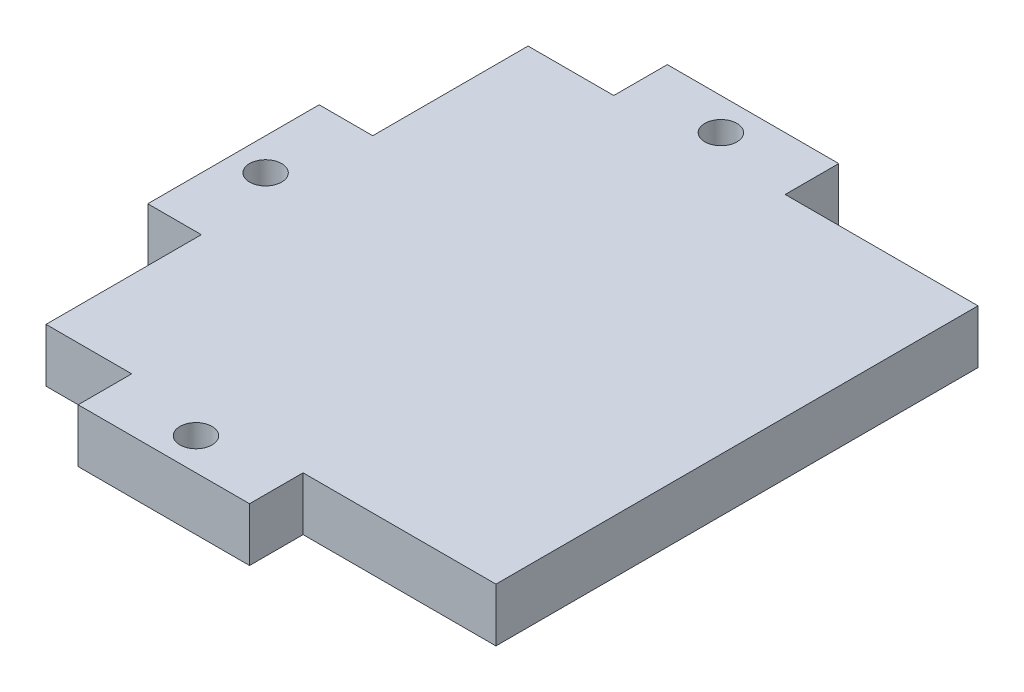
ISO-10303-21;
HEADER;
FILE_DESCRIPTION(('STEP AP214'),'2;1');
FILE_NAME('part.step','',(''),(''),'','','');
FILE_SCHEMA(('AUTOMOTIVE_DESIGN { 1 0 10303 214 1 1 1 1 }'));
ENDSEC;
DATA;
#1=APPLICATION_CONTEXT('core data for automotive mechanical design processes');
#2=APPLICATION_PROTOCOL_DEFINITION('international standard','automotive_design',2000,#1);
#3=PRODUCT_CONTEXT('',#1,'mechanical');
#4=PRODUCT('Part','Part','',(#3));
#5=PRODUCT_RELATED_PRODUCT_CATEGORY('part','',(#4));
#6=PRODUCT_DEFINITION_FORMATION('','',#4);
#7=PRODUCT_DEFINITION_CONTEXT('part definition',#1,'design');
#8=PRODUCT_DEFINITION('design','',#6,#7);
#9=PRODUCT_DEFINITION_SHAPE('','',#8);
#10=(LENGTH_UNIT() NAMED_UNIT(*) SI_UNIT(.MILLI.,.METRE.));
#11=(NAMED_UNIT(*) PLANE_ANGLE_UNIT() SI_UNIT($,.RADIAN.));
#12=(NAMED_UNIT(*) SI_UNIT($,.STERADIAN.) SOLID_ANGLE_UNIT());
#13=UNCERTAINTY_MEASURE_WITH_UNIT(LENGTH_MEASURE(1.E-05),#10,'distance_accuracy_value','');
#14=(GEOMETRIC_REPRESENTATION_CONTEXT(3) GLOBAL_UNCERTAINTY_ASSIGNED_CONTEXT((#13)) GLOBAL_UNIT_ASSIGNED_CONTEXT((#10,
#11,#12)) REPRESENTATION_CONTEXT('',''));
#15=CARTESIAN_POINT('',(0.,0.,0.));
#16=DIRECTION('',(0.,0.,1.));
#17=DIRECTION('',(1.,0.,0.));
#18=AXIS2_PLACEMENT_3D('',#15,#16,#17);
#19=CARTESIAN_POINT('',(-16.,5.,22.5));
#20=DIRECTION('',(1.,0.,0.));
#21=DIRECTION('',(0.,0.,-1.));
#22=AXIS2_PLACEMENT_3D('',#19,#20,#21);
#23=PLANE('',#22);
#24=DIRECTION('',(0.,0.,1.));
#25=VECTOR('',#24,1.);
#26=CARTESIAN_POINT('',(-16.,0.,22.5));
#27=LINE('',#26,#25);
#28=CARTESIAN_POINT('',(-16.,0.,-22.5));
#29=VERTEX_POINT('',#28);
#30=CARTESIAN_POINT('',(-16.,0.,-8.));
#31=VERTEX_POINT('',#30);
#32=EDGE_CURVE('E164',#29,#31,#27,.T.);
#33=ORIENTED_EDGE('',*,*,#32,.T.);
#34=DIRECTION('',(0.,1.,0.));
#35=VECTOR('',#34,1.);
#36=CARTESIAN_POINT('',(-16.,5.,-8.));
#37=LINE('',#36,#35);
#38=CARTESIAN_POINT('',(-16.,5.,-8.));
#39=VERTEX_POINT('',#38);
#40=EDGE_CURVE('E212',#31,#39,#37,.T.);
#41=ORIENTED_EDGE('',*,*,#40,.T.);
#42=DIRECTION('',(0.,0.,1.));
#43=VECTOR('',#42,1.);
#44=CARTESIAN_POINT('',(-16.,5.,22.5));
#45=LINE('',#44,#43);
#46=CARTESIAN_POINT('',(-16.,5.,-22.5));
#47=VERTEX_POINT('',#46);
#48=EDGE_CURVE('E274',#47,#39,#45,.T.);
#49=ORIENTED_EDGE('',*,*,#48,.F.);
#50=DIRECTION('',(0.,-1.,0.));
#51=VECTOR('',#50,1.);
#52=CARTESIAN_POINT('',(-16.,5.,-22.5));
#53=LINE('',#52,#51);
#54=EDGE_CURVE('E48',#47,#29,#53,.T.);
#55=ORIENTED_EDGE('',*,*,#54,.T.);
#56=EDGE_LOOP('',(#33,#41,#49,#55));
#57=FACE_BOUND('',#56,.T.);
#58=ADVANCED_FACE('F40',(#57),#23,.F.);
#59=CARTESIAN_POINT('',(16.,5.,22.5));
#60=DIRECTION('',(0.,0.,-1.));
#61=DIRECTION('',(-1.,0.,0.));
#62=AXIS2_PLACEMENT_3D('',#59,#60,#61);
#63=PLANE('',#62);
#64=DIRECTION('',(0.,-1.,0.));
#65=VECTOR('',#64,1.);
#66=CARTESIAN_POINT('',(-8.,5.,22.5));
#67=LINE('',#66,#65);
#68=CARTESIAN_POINT('',(-8.,5.,22.5));
#69=VERTEX_POINT('',#68);
#70=CARTESIAN_POINT('',(-8.,0.,22.5));
#71=VERTEX_POINT('',#70);
#72=EDGE_CURVE('E240',#69,#71,#67,.T.);
#73=ORIENTED_EDGE('',*,*,#72,.F.);
#74=DIRECTION('',(1.,0.,0.));
#75=VECTOR('',#74,1.);
#76=CARTESIAN_POINT('',(16.,5.,22.5));
#77=LINE('',#76,#75);
#78=CARTESIAN_POINT('',(-16.,5.,22.5));
#79=VERTEX_POINT('',#78);
#80=EDGE_CURVE('E279',#79,#69,#77,.T.);
#81=ORIENTED_EDGE('',*,*,#80,.F.);
#82=DIRECTION('',(0.,-1.,0.));
#83=VECTOR('',#82,1.);
#84=CARTESIAN_POINT('',(-16.,5.,22.5));
#85=LINE('',#84,#83);
#86=CARTESIAN_POINT('',(-16.,0.,22.5));
#87=VERTEX_POINT('',#86);
#88=EDGE_CURVE('E11',#79,#87,#85,.T.);
#89=ORIENTED_EDGE('',*,*,#88,.T.);
#90=DIRECTION('',(1.,0.,0.));
#91=VECTOR('',#90,1.);
#92=CARTESIAN_POINT('',(16.,0.,22.5));
#93=LINE('',#92,#91);
#94=EDGE_CURVE('E163',#87,#71,#93,.T.);
#95=ORIENTED_EDGE('',*,*,#94,.T.);
#96=EDGE_LOOP('',(#73,#81,#89,#95));
#97=FACE_BOUND('',#96,.T.);
#98=ADVANCED_FACE('F336',(#97),#63,.F.);
#99=DIRECTION('',(0.,1.,0.));
#100=VECTOR('',#99,1.);
#101=CARTESIAN_POINT('',(8.,5.,22.5));
#102=LINE('',#101,#100);
#103=CARTESIAN_POINT('',(8.,0.,22.5));
#104=VERTEX_POINT('',#103);
#105=CARTESIAN_POINT('',(8.,5.,22.5));
#106=VERTEX_POINT('',#105);
#107=EDGE_CURVE('E160',#104,#106,#102,.T.);
#108=ORIENTED_EDGE('',*,*,#107,.F.);
#109=CARTESIAN_POINT('',(26.,0.,22.5));
#110=VERTEX_POINT('',#109);
#111=EDGE_CURVE('E154',#104,#110,#93,.T.);
#112=ORIENTED_EDGE('',*,*,#111,.T.);
#113=DIRECTION('',(0.,1.,0.));
#114=VECTOR('',#113,1.);
#115=CARTESIAN_POINT('',(26.,0.,22.5));
#116=LINE('',#115,#114);
#117=CARTESIAN_POINT('',(26.,5.,22.5));
#118=VERTEX_POINT('',#117);
#119=EDGE_CURVE('E158',#110,#118,#116,.T.);
#120=ORIENTED_EDGE('',*,*,#119,.T.);
#121=EDGE_CURVE('E277',#106,#118,#77,.T.);
#122=ORIENTED_EDGE('',*,*,#121,.F.);
#123=EDGE_LOOP('',(#108,#112,#120,#122));
#124=FACE_BOUND('',#123,.T.);
#125=ADVANCED_FACE('F156',(#124),#63,.F.);
#126=CARTESIAN_POINT('',(16.,5.,-22.5));
#127=DIRECTION('',(0.,0.,1.));
#128=DIRECTION('',(1.,0.,0.));
#129=AXIS2_PLACEMENT_3D('',#126,#127,#128);
#130=PLANE('',#129);
#131=DIRECTION('',(-1.,0.,0.));
#132=VECTOR('',#131,1.);
#133=CARTESIAN_POINT('',(16.,5.,-22.5));
#134=LINE('',#133,#132);
#135=CARTESIAN_POINT('',(-8.,5.,-22.5));
#136=VERTEX_POINT('',#135);
#137=EDGE_CURVE('E282',#136,#47,#134,.T.);
#138=ORIENTED_EDGE('',*,*,#137,.F.);
#139=DIRECTION('',(0.,-1.,0.));
#140=VECTOR('',#139,1.);
#141=CARTESIAN_POINT('',(-8.,5.,-22.5));
#142=LINE('',#141,#140);
#143=CARTESIAN_POINT('',(-8.,0.,-22.5));
#144=VERTEX_POINT('',#143);
#145=EDGE_CURVE('E270',#136,#144,#142,.T.);
#146=ORIENTED_EDGE('',*,*,#145,.T.);
#147=DIRECTION('',(-1.,0.,0.));
#148=VECTOR('',#147,1.);
#149=CARTESIAN_POINT('',(16.,0.,-22.5));
#150=LINE('',#149,#148);
#151=EDGE_CURVE('E289',#144,#29,#150,.T.);
#152=ORIENTED_EDGE('',*,*,#151,.T.);
#153=ORIENTED_EDGE('',*,*,#54,.F.);
#154=EDGE_LOOP('',(#138,#146,#152,#153));
#155=FACE_BOUND('',#154,.T.);
#156=ADVANCED_FACE('F312',(#155),#130,.F.);
#157=CARTESIAN_POINT('',(-16.,5.,8.));
#158=VERTEX_POINT('',#157);
#159=EDGE_CURVE('E278',#158,#79,#45,.T.);
#160=ORIENTED_EDGE('',*,*,#159,.F.);
#161=DIRECTION('',(0.,-1.,0.));
#162=VECTOR('',#161,1.);
#163=CARTESIAN_POINT('',(-16.,5.,8.));
#164=LINE('',#163,#162);
#165=CARTESIAN_POINT('',(-16.,0.,8.));
#166=VERTEX_POINT('',#165);
#167=EDGE_CURVE('E208',#158,#166,#164,.T.);
#168=ORIENTED_EDGE('',*,*,#167,.T.);
#169=EDGE_CURVE('E273',#166,#87,#27,.T.);
#170=ORIENTED_EDGE('',*,*,#169,.T.);
#171=ORIENTED_EDGE('',*,*,#88,.F.);
#172=EDGE_LOOP('',(#160,#168,#170,#171));
#173=FACE_BOUND('',#172,.T.);
#174=ADVANCED_FACE('F42',(#173),#23,.F.);
#175=CARTESIAN_POINT('',(26.,0.,-22.5));
#176=VERTEX_POINT('',#175);
#177=CARTESIAN_POINT('',(8.,0.,-22.5));
#178=VERTEX_POINT('',#177);
#179=EDGE_CURVE('E180',#176,#178,#150,.T.);
#180=ORIENTED_EDGE('',*,*,#179,.T.);
#181=DIRECTION('',(0.,1.,0.));
#182=VECTOR('',#181,1.);
#183=CARTESIAN_POINT('',(8.,5.,-22.5));
#184=LINE('',#183,#182);
#185=CARTESIAN_POINT('',(8.,5.,-22.5));
#186=VERTEX_POINT('',#185);
#187=EDGE_CURVE('E265',#178,#186,#184,.T.);
#188=ORIENTED_EDGE('',*,*,#187,.T.);
#189=CARTESIAN_POINT('',(26.,5.,-22.5));
#190=VERTEX_POINT('',#189);
#191=EDGE_CURVE('E283',#190,#186,#134,.T.);
#192=ORIENTED_EDGE('',*,*,#191,.F.);
#193=DIRECTION('',(0.,1.,0.));
#194=VECTOR('',#193,1.);
#195=CARTESIAN_POINT('',(26.,0.,-22.5));
#196=LINE('',#195,#194);
#197=EDGE_CURVE('E173',#176,#190,#196,.T.);
#198=ORIENTED_EDGE('',*,*,#197,.F.);
#199=EDGE_LOOP('',(#180,#188,#192,#198));
#200=FACE_BOUND('',#199,.T.);
#201=ADVANCED_FACE('F323',(#200),#130,.F.);
#202=CARTESIAN_POINT('',(0.,5.,0.));
#203=DIRECTION('',(0.,1.,0.));
#204=DIRECTION('',(0.,0.,1.));
#205=AXIS2_PLACEMENT_3D('',#202,#203,#204);
#206=PLANE('',#205);
#207=CARTESIAN_POINT('',(-18.,5.,0.));
#208=DIRECTION('',(0.,1.,0.));
#209=DIRECTION('',(0.,0.,1.));
#210=AXIS2_PLACEMENT_3D('',#207,#208,#209);
#211=CIRCLE('',#210,1.5);
#212=CARTESIAN_POINT('',(-18.,5.,1.5));
#213=VERTEX_POINT('',#212);
#214=EDGE_CURVE('E185',#213,#213,#211,.T.);
#215=ORIENTED_EDGE('',*,*,#214,.F.);
#216=EDGE_LOOP('',(#215));
#217=FACE_BOUND('',#216,.T.);
#218=ORIENTED_EDGE('',*,*,#48,.T.);
#219=DIRECTION('',(-1.,0.,0.));
#220=VECTOR('',#219,1.);
#221=CARTESIAN_POINT('',(-11.,5.,-8.));
#222=LINE('',#221,#220);
#223=CARTESIAN_POINT('',(-21.,5.,-7.99999999999999));
#224=VERTEX_POINT('',#223);
#225=EDGE_CURVE('E197',#39,#224,#222,.T.);
#226=ORIENTED_EDGE('',*,*,#225,.T.);
#227=DIRECTION('',(0.,0.,1.));
#228=VECTOR('',#227,1.);
#229=CARTESIAN_POINT('',(-21.,5.,8.));
#230=LINE('',#229,#228);
#231=CARTESIAN_POINT('',(-21.,5.,8.));
#232=VERTEX_POINT('',#231);
#233=EDGE_CURVE('E190',#224,#232,#230,.T.);
#234=ORIENTED_EDGE('',*,*,#233,.T.);
#235=DIRECTION('',(1.,0.,0.));
#236=VECTOR('',#235,1.);
#237=CARTESIAN_POINT('',(-11.,5.,8.));
#238=LINE('',#237,#236);
#239=EDGE_CURVE('E55',#232,#158,#238,.T.);
#240=ORIENTED_EDGE('',*,*,#239,.T.);
#241=ORIENTED_EDGE('',*,*,#159,.T.);
#242=ORIENTED_EDGE('',*,*,#80,.T.);
#243=DIRECTION('',(0.,0.,-1.));
#244=VECTOR('',#243,1.);
#245=CARTESIAN_POINT('',(-8.,5.,17.5));
#246=LINE('',#245,#244);
#247=CARTESIAN_POINT('',(-8.,5.,27.5));
#248=VERTEX_POINT('',#247);
#249=EDGE_CURVE('E219',#248,#69,#246,.T.);
#250=ORIENTED_EDGE('',*,*,#249,.F.);
#251=DIRECTION('',(-1.,0.,0.));
#252=VECTOR('',#251,1.);
#253=CARTESIAN_POINT('',(8.,5.,27.5));
#254=LINE('',#253,#252);
#255=CARTESIAN_POINT('',(8.,5.,27.5));
#256=VERTEX_POINT('',#255);
#257=EDGE_CURVE('E231',#256,#248,#254,.T.);
#258=ORIENTED_EDGE('',*,*,#257,.F.);
#259=DIRECTION('',(0.,0.,1.));
#260=VECTOR('',#259,1.);
#261=CARTESIAN_POINT('',(8.,5.,17.5));
#262=LINE('',#261,#260);
#263=EDGE_CURVE('E62',#106,#256,#262,.T.);
#264=ORIENTED_EDGE('',*,*,#263,.F.);
#265=ORIENTED_EDGE('',*,*,#121,.T.);
#266=DIRECTION('',(0.,0.,-1.));
#267=VECTOR('',#266,1.);
#268=CARTESIAN_POINT('',(26.,5.,-22.5));
#269=LINE('',#268,#267);
#270=EDGE_CURVE('E172',#118,#190,#269,.T.);
#271=ORIENTED_EDGE('',*,*,#270,.T.);
#272=ORIENTED_EDGE('',*,*,#191,.T.);
#273=DIRECTION('',(0.,0.,-1.));
#274=VECTOR('',#273,1.);
#275=CARTESIAN_POINT('',(8.,5.,-17.5));
#276=LINE('',#275,#274);
#277=CARTESIAN_POINT('',(8.,5.,-27.5));
#278=VERTEX_POINT('',#277);
#279=EDGE_CURVE('E259',#186,#278,#276,.T.);
#280=ORIENTED_EDGE('',*,*,#279,.T.);
#281=DIRECTION('',(-1.,0.,0.));
#282=VECTOR('',#281,1.);
#283=CARTESIAN_POINT('',(8.,5.,-27.5));
#284=LINE('',#283,#282);
#285=CARTESIAN_POINT('',(-8.,5.,-27.5));
#286=VERTEX_POINT('',#285);
#287=EDGE_CURVE('E252',#278,#286,#284,.T.);
#288=ORIENTED_EDGE('',*,*,#287,.T.);
#289=DIRECTION('',(0.,0.,1.));
#290=VECTOR('',#289,1.);
#291=CARTESIAN_POINT('',(-8.,5.,-17.5));
#292=LINE('',#291,#290);
#293=EDGE_CURVE('E246',#286,#136,#292,.T.);
#294=ORIENTED_EDGE('',*,*,#293,.T.);
#295=ORIENTED_EDGE('',*,*,#137,.T.);
#296=EDGE_LOOP('',(#218,#226,#234,#240,#241,#242,#250,#258,#264,#265,#271,#272,#280,#288,#294,#295));
#297=FACE_BOUND('',#296,.T.);
#298=CARTESIAN_POINT('',(0.,5.,24.5));
#299=DIRECTION('',(0.,-1.,0.));
#300=DIRECTION('',(0.,0.,-1.));
#301=AXIS2_PLACEMENT_3D('',#298,#299,#300);
#302=CIRCLE('',#301,1.5);
#303=CARTESIAN_POINT('',(0.,5.,23.));
#304=VERTEX_POINT('',#303);
#305=EDGE_CURVE('E215',#304,#304,#302,.T.);
#306=ORIENTED_EDGE('',*,*,#305,.T.);
#307=EDGE_LOOP('',(#306));
#308=FACE_BOUND('',#307,.T.);
#309=CARTESIAN_POINT('',(0.,5.,-24.5));
#310=DIRECTION('',(0.,1.,0.));
#311=DIRECTION('',(0.,0.,1.));
#312=AXIS2_PLACEMENT_3D('',#309,#310,#311);
#313=CIRCLE('',#312,1.5);
#314=CARTESIAN_POINT('',(0.,5.,-23.));
#315=VERTEX_POINT('',#314);
#316=EDGE_CURVE('E242',#315,#315,#313,.T.);
#317=ORIENTED_EDGE('',*,*,#316,.F.);
#318=EDGE_LOOP('',(#317));
#319=FACE_BOUND('',#318,.T.);
#320=ADVANCED_FACE('F308',(#217,#297,#308,#319),#206,.T.);
#321=CARTESIAN_POINT('',(0.,0.,0.));
#322=DIRECTION('',(0.,1.,0.));
#323=DIRECTION('',(0.,0.,1.));
#324=AXIS2_PLACEMENT_3D('',#321,#322,#323);
#325=PLANE('',#324);
#326=CARTESIAN_POINT('',(-18.,0.,0.));
#327=DIRECTION('',(0.,1.,0.));
#328=DIRECTION('',(0.,0.,1.));
#329=AXIS2_PLACEMENT_3D('',#326,#327,#328);
#330=CIRCLE('',#329,1.5);
#331=CARTESIAN_POINT('',(-18.,0.,1.5));
#332=VERTEX_POINT('',#331);
#333=EDGE_CURVE('E187',#332,#332,#330,.T.);
#334=ORIENTED_EDGE('',*,*,#333,.T.);
#335=EDGE_LOOP('',(#334));
#336=FACE_BOUND('',#335,.T.);
#337=ORIENTED_EDGE('',*,*,#169,.F.);
#338=DIRECTION('',(1.,0.,0.));
#339=VECTOR('',#338,1.);
#340=CARTESIAN_POINT('',(-11.,0.,8.));
#341=LINE('',#340,#339);
#342=CARTESIAN_POINT('',(-21.,0.,8.));
#343=VERTEX_POINT('',#342);
#344=EDGE_CURVE('E196',#343,#166,#341,.T.);
#345=ORIENTED_EDGE('',*,*,#344,.F.);
#346=DIRECTION('',(0.,0.,1.));
#347=VECTOR('',#346,1.);
#348=CARTESIAN_POINT('',(-21.,0.,8.));
#349=LINE('',#348,#347);
#350=CARTESIAN_POINT('',(-21.,0.,-7.99999999999999));
#351=VERTEX_POINT('',#350);
#352=EDGE_CURVE('E193',#351,#343,#349,.T.);
#353=ORIENTED_EDGE('',*,*,#352,.F.);
#354=DIRECTION('',(-1.,0.,0.));
#355=VECTOR('',#354,1.);
#356=CARTESIAN_POINT('',(-11.,0.,-8.));
#357=LINE('',#356,#355);
#358=EDGE_CURVE('E199',#31,#351,#357,.T.);
#359=ORIENTED_EDGE('',*,*,#358,.F.);
#360=ORIENTED_EDGE('',*,*,#32,.F.);
#361=ORIENTED_EDGE('',*,*,#151,.F.);
#362=DIRECTION('',(0.,0.,1.));
#363=VECTOR('',#362,1.);
#364=CARTESIAN_POINT('',(-8.,0.,-17.5));
#365=LINE('',#364,#363);
#366=CARTESIAN_POINT('',(-8.,0.,-27.5));
#367=VERTEX_POINT('',#366);
#368=EDGE_CURVE('E249',#367,#144,#365,.T.);
#369=ORIENTED_EDGE('',*,*,#368,.F.);
#370=DIRECTION('',(-1.,0.,0.));
#371=VECTOR('',#370,1.);
#372=CARTESIAN_POINT('',(8.,0.,-27.5));
#373=LINE('',#372,#371);
#374=CARTESIAN_POINT('',(8.,0.,-27.5));
#375=VERTEX_POINT('',#374);
#376=EDGE_CURVE('E254',#375,#367,#373,.T.);
#377=ORIENTED_EDGE('',*,*,#376,.F.);
#378=DIRECTION('',(0.,0.,-1.));
#379=VECTOR('',#378,1.);
#380=CARTESIAN_POINT('',(8.,0.,-17.5));
#381=LINE('',#380,#379);
#382=EDGE_CURVE('E251',#178,#375,#381,.T.);
#383=ORIENTED_EDGE('',*,*,#382,.F.);
#384=ORIENTED_EDGE('',*,*,#179,.F.);
#385=DIRECTION('',(0.,0.,-1.));
#386=VECTOR('',#385,1.);
#387=CARTESIAN_POINT('',(26.,0.,-22.5));
#388=LINE('',#387,#386);
#389=EDGE_CURVE('E170',#110,#176,#388,.T.);
#390=ORIENTED_EDGE('',*,*,#389,.F.);
#391=ORIENTED_EDGE('',*,*,#111,.F.);
#392=DIRECTION('',(0.,0.,1.));
#393=VECTOR('',#392,1.);
#394=CARTESIAN_POINT('',(8.,0.,17.5));
#395=LINE('',#394,#393);
#396=CARTESIAN_POINT('',(8.,0.,27.5));
#397=VERTEX_POINT('',#396);
#398=EDGE_CURVE('E227',#104,#397,#395,.T.);
#399=ORIENTED_EDGE('',*,*,#398,.T.);
#400=DIRECTION('',(-1.,0.,0.));
#401=VECTOR('',#400,1.);
#402=CARTESIAN_POINT('',(8.,0.,27.5));
#403=LINE('',#402,#401);
#404=CARTESIAN_POINT('',(-8.,0.,27.5));
#405=VERTEX_POINT('',#404);
#406=EDGE_CURVE('E225',#397,#405,#403,.T.);
#407=ORIENTED_EDGE('',*,*,#406,.T.);
#408=DIRECTION('',(0.,0.,-1.));
#409=VECTOR('',#408,1.);
#410=CARTESIAN_POINT('',(-8.,0.,17.5));
#411=LINE('',#410,#409);
#412=EDGE_CURVE('E222',#405,#71,#411,.T.);
#413=ORIENTED_EDGE('',*,*,#412,.T.);
#414=ORIENTED_EDGE('',*,*,#94,.F.);
#415=EDGE_LOOP('',(#337,#345,#353,#359,#360,#361,#369,#377,#383,#384,#390,#391,#399,#407,#413,#414));
#416=FACE_BOUND('',#415,.T.);
#417=CARTESIAN_POINT('',(0.,0.,24.5));
#418=DIRECTION('',(0.,-1.,0.));
#419=DIRECTION('',(0.,0.,-1.));
#420=AXIS2_PLACEMENT_3D('',#417,#418,#419);
#421=CIRCLE('',#420,1.5);
#422=CARTESIAN_POINT('',(0.,0.,23.));
#423=VERTEX_POINT('',#422);
#424=EDGE_CURVE('E216',#423,#423,#421,.T.);
#425=ORIENTED_EDGE('',*,*,#424,.F.);
#426=EDGE_LOOP('',(#425));
#427=FACE_BOUND('',#426,.T.);
#428=CARTESIAN_POINT('',(0.,0.,-24.5));
#429=DIRECTION('',(0.,1.,0.));
#430=DIRECTION('',(0.,0.,1.));
#431=AXIS2_PLACEMENT_3D('',#428,#429,#430);
#432=CIRCLE('',#431,1.5);
#433=CARTESIAN_POINT('',(0.,0.,-23.));
#434=VERTEX_POINT('',#433);
#435=EDGE_CURVE('E243',#434,#434,#432,.T.);
#436=ORIENTED_EDGE('',*,*,#435,.T.);
#437=EDGE_LOOP('',(#436));
#438=FACE_BOUND('',#437,.T.);
#439=ADVANCED_FACE('F176',(#336,#416,#427,#438),#325,.F.);
#440=CARTESIAN_POINT('',(-8.,0.,-17.5));
#441=DIRECTION('',(-1.,0.,0.));
#442=DIRECTION('',(0.,0.,1.));
#443=AXIS2_PLACEMENT_3D('',#440,#441,#442);
#444=PLANE('',#443);
#445=ORIENTED_EDGE('',*,*,#145,.F.);
#446=ORIENTED_EDGE('',*,*,#293,.F.);
#447=DIRECTION('',(0.,1.,0.));
#448=VECTOR('',#447,1.);
#449=CARTESIAN_POINT('',(-8.,0.,-27.5));
#450=LINE('',#449,#448);
#451=EDGE_CURVE('E263',#367,#286,#450,.T.);
#452=ORIENTED_EDGE('',*,*,#451,.F.);
#453=ORIENTED_EDGE('',*,*,#368,.T.);
#454=EDGE_LOOP('',(#445,#446,#452,#453));
#455=FACE_BOUND('',#454,.T.);
#456=ADVANCED_FACE('F314',(#455),#444,.T.);
#457=CARTESIAN_POINT('',(8.,0.,-17.5));
#458=DIRECTION('',(1.,0.,0.));
#459=DIRECTION('',(0.,0.,-1.));
#460=AXIS2_PLACEMENT_3D('',#457,#458,#459);
#461=PLANE('',#460);
#462=ORIENTED_EDGE('',*,*,#187,.F.);
#463=ORIENTED_EDGE('',*,*,#382,.T.);
#464=DIRECTION('',(0.,1.,0.));
#465=VECTOR('',#464,1.);
#466=CARTESIAN_POINT('',(8.,0.,-27.5));
#467=LINE('',#466,#465);
#468=EDGE_CURVE('E257',#375,#278,#467,.T.);
#469=ORIENTED_EDGE('',*,*,#468,.T.);
#470=ORIENTED_EDGE('',*,*,#279,.F.);
#471=EDGE_LOOP('',(#462,#463,#469,#470));
#472=FACE_BOUND('',#471,.T.);
#473=ADVANCED_FACE('F321',(#472),#461,.T.);
#474=CARTESIAN_POINT('',(8.,0.,-27.5));
#475=DIRECTION('',(0.,0.,-1.));
#476=DIRECTION('',(-1.,0.,0.));
#477=AXIS2_PLACEMENT_3D('',#474,#475,#476);
#478=PLANE('',#477);
#479=ORIENTED_EDGE('',*,*,#287,.F.);
#480=ORIENTED_EDGE('',*,*,#468,.F.);
#481=ORIENTED_EDGE('',*,*,#376,.T.);
#482=ORIENTED_EDGE('',*,*,#451,.T.);
#483=EDGE_LOOP('',(#479,#480,#481,#482));
#484=FACE_BOUND('',#483,.T.);
#485=ADVANCED_FACE('F319',(#484),#478,.T.);
#486=CARTESIAN_POINT('',(0.,0.,-24.5));
#487=DIRECTION('',(0.,1.,0.));
#488=DIRECTION('',(0.,0.,1.));
#489=AXIS2_PLACEMENT_3D('',#486,#487,#488);
#490=CYLINDRICAL_SURFACE('',#489,1.5);
#491=ORIENTED_EDGE('',*,*,#435,.F.);
#492=EDGE_LOOP('',(#491));
#493=FACE_BOUND('',#492,.T.);
#494=ORIENTED_EDGE('',*,*,#316,.T.);
#495=EDGE_LOOP('',(#494));
#496=FACE_BOUND('',#495,.T.);
#497=ADVANCED_FACE('F368',(#493,#496),#490,.F.);
#498=CARTESIAN_POINT('',(-8.,0.,17.5));
#499=DIRECTION('',(1.,0.,0.));
#500=DIRECTION('',(0.,0.,-1.));
#501=AXIS2_PLACEMENT_3D('',#498,#499,#500);
#502=PLANE('',#501);
#503=ORIENTED_EDGE('',*,*,#249,.T.);
#504=ORIENTED_EDGE('',*,*,#72,.T.);
#505=ORIENTED_EDGE('',*,*,#412,.F.);
#506=DIRECTION('',(0.,1.,0.));
#507=VECTOR('',#506,1.);
#508=CARTESIAN_POINT('',(-8.,0.,27.5));
#509=LINE('',#508,#507);
#510=EDGE_CURVE('E229',#405,#248,#509,.T.);
#511=ORIENTED_EDGE('',*,*,#510,.T.);
#512=EDGE_LOOP('',(#503,#504,#505,#511));
#513=FACE_BOUND('',#512,.T.);
#514=ADVANCED_FACE('F354',(#513),#502,.F.);
#515=CARTESIAN_POINT('',(8.,0.,17.5));
#516=DIRECTION('',(-1.,0.,0.));
#517=DIRECTION('',(0.,0.,1.));
#518=AXIS2_PLACEMENT_3D('',#515,#516,#517);
#519=PLANE('',#518);
#520=ORIENTED_EDGE('',*,*,#398,.F.);
#521=ORIENTED_EDGE('',*,*,#107,.T.);
#522=ORIENTED_EDGE('',*,*,#263,.T.);
#523=DIRECTION('',(0.,1.,0.));
#524=VECTOR('',#523,1.);
#525=CARTESIAN_POINT('',(8.,0.,27.5));
#526=LINE('',#525,#524);
#527=EDGE_CURVE('E234',#397,#256,#526,.T.);
#528=ORIENTED_EDGE('',*,*,#527,.F.);
#529=EDGE_LOOP('',(#520,#521,#522,#528));
#530=FACE_BOUND('',#529,.T.);
#531=ADVANCED_FACE('F359',(#530),#519,.F.);
#532=CARTESIAN_POINT('',(8.,0.,27.5));
#533=DIRECTION('',(0.,0.,-1.));
#534=DIRECTION('',(-1.,0.,0.));
#535=AXIS2_PLACEMENT_3D('',#532,#533,#534);
#536=PLANE('',#535);
#537=ORIENTED_EDGE('',*,*,#257,.T.);
#538=ORIENTED_EDGE('',*,*,#510,.F.);
#539=ORIENTED_EDGE('',*,*,#406,.F.);
#540=ORIENTED_EDGE('',*,*,#527,.T.);
#541=EDGE_LOOP('',(#537,#538,#539,#540));
#542=FACE_BOUND('',#541,.T.);
#543=ADVANCED_FACE('F356',(#542),#536,.F.);
#544=CARTESIAN_POINT('',(0.,0.,24.5));
#545=DIRECTION('',(0.,1.,0.));
#546=DIRECTION('',(0.,0.,1.));
#547=AXIS2_PLACEMENT_3D('',#544,#545,#546);
#548=CYLINDRICAL_SURFACE('',#547,1.5);
#549=ORIENTED_EDGE('',*,*,#424,.T.);
#550=EDGE_LOOP('',(#549));
#551=FACE_BOUND('',#550,.T.);
#552=ORIENTED_EDGE('',*,*,#305,.F.);
#553=EDGE_LOOP('',(#552));
#554=FACE_BOUND('',#553,.T.);
#555=ADVANCED_FACE('F366',(#551,#554),#548,.F.);
#556=CARTESIAN_POINT('',(-11.,0.,-8.));
#557=DIRECTION('',(0.,0.,-1.));
#558=DIRECTION('',(-1.,0.,0.));
#559=AXIS2_PLACEMENT_3D('',#556,#557,#558);
#560=PLANE('',#559);
#561=ORIENTED_EDGE('',*,*,#40,.F.);
#562=ORIENTED_EDGE('',*,*,#358,.T.);
#563=DIRECTION('',(0.,1.,0.));
#564=VECTOR('',#563,1.);
#565=CARTESIAN_POINT('',(-21.,0.,-7.99999999999999));
#566=LINE('',#565,#564);
#567=EDGE_CURVE('E205',#351,#224,#566,.T.);
#568=ORIENTED_EDGE('',*,*,#567,.T.);
#569=ORIENTED_EDGE('',*,*,#225,.F.);
#570=EDGE_LOOP('',(#561,#562,#568,#569));
#571=FACE_BOUND('',#570,.T.);
#572=ADVANCED_FACE('F304',(#571),#560,.T.);
#573=CARTESIAN_POINT('',(-11.,0.,8.));
#574=DIRECTION('',(0.,0.,1.));
#575=DIRECTION('',(1.,0.,0.));
#576=AXIS2_PLACEMENT_3D('',#573,#574,#575);
#577=PLANE('',#576);
#578=ORIENTED_EDGE('',*,*,#167,.F.);
#579=ORIENTED_EDGE('',*,*,#239,.F.);
#580=DIRECTION('',(0.,1.,0.));
#581=VECTOR('',#580,1.);
#582=CARTESIAN_POINT('',(-21.,0.,8.));
#583=LINE('',#582,#581);
#584=EDGE_CURVE('E201',#343,#232,#583,.T.);
#585=ORIENTED_EDGE('',*,*,#584,.F.);
#586=ORIENTED_EDGE('',*,*,#344,.T.);
#587=EDGE_LOOP('',(#578,#579,#585,#586));
#588=FACE_BOUND('',#587,.T.);
#589=ADVANCED_FACE('F397',(#588),#577,.T.);
#590=CARTESIAN_POINT('',(-21.,0.,8.));
#591=DIRECTION('',(-1.,0.,0.));
#592=DIRECTION('',(0.,0.,1.));
#593=AXIS2_PLACEMENT_3D('',#590,#591,#592);
#594=PLANE('',#593);
#595=ORIENTED_EDGE('',*,*,#233,.F.);
#596=ORIENTED_EDGE('',*,*,#567,.F.);
#597=ORIENTED_EDGE('',*,*,#352,.T.);
#598=ORIENTED_EDGE('',*,*,#584,.T.);
#599=EDGE_LOOP('',(#595,#596,#597,#598));
#600=FACE_BOUND('',#599,.T.);
#601=ADVANCED_FACE('F307',(#600),#594,.T.);
#602=CARTESIAN_POINT('',(-18.,0.,0.));
#603=DIRECTION('',(0.,1.,0.));
#604=DIRECTION('',(0.,0.,1.));
#605=AXIS2_PLACEMENT_3D('',#602,#603,#604);
#606=CYLINDRICAL_SURFACE('',#605,1.5);
#607=ORIENTED_EDGE('',*,*,#333,.F.);
#608=EDGE_LOOP('',(#607));
#609=FACE_BOUND('',#608,.T.);
#610=ORIENTED_EDGE('',*,*,#214,.T.);
#611=EDGE_LOOP('',(#610));
#612=FACE_BOUND('',#611,.T.);
#613=ADVANCED_FACE('F387',(#609,#612),#606,.F.);
#614=CARTESIAN_POINT('',(26.,0.,-22.5));
#615=DIRECTION('',(1.,0.,0.));
#616=DIRECTION('',(0.,0.,-1.));
#617=AXIS2_PLACEMENT_3D('',#614,#615,#616);
#618=PLANE('',#617);
#619=ORIENTED_EDGE('',*,*,#270,.F.);
#620=ORIENTED_EDGE('',*,*,#119,.F.);
#621=ORIENTED_EDGE('',*,*,#389,.T.);
#622=ORIENTED_EDGE('',*,*,#197,.T.);
#623=EDGE_LOOP('',(#619,#620,#621,#622));
#624=FACE_BOUND('',#623,.T.);
#625=ADVANCED_FACE('F168',(#624),#618,.T.);
#626=CLOSED_SHELL('',(#58,#98,#125,#156,#174,#201,#320,#439,#456,#473,#485,#497,#514,#531,#543,
#555,#572,#589,#601,#613,#625));
#627=MANIFOLD_SOLID_BREP('B2',#626);
#628=ADVANCED_BREP_SHAPE_REPRESENTATION('',(#18,#627),#14);
#629=SHAPE_DEFINITION_REPRESENTATION(#9,#628);
ENDSEC;
END-ISO-10303-21;
